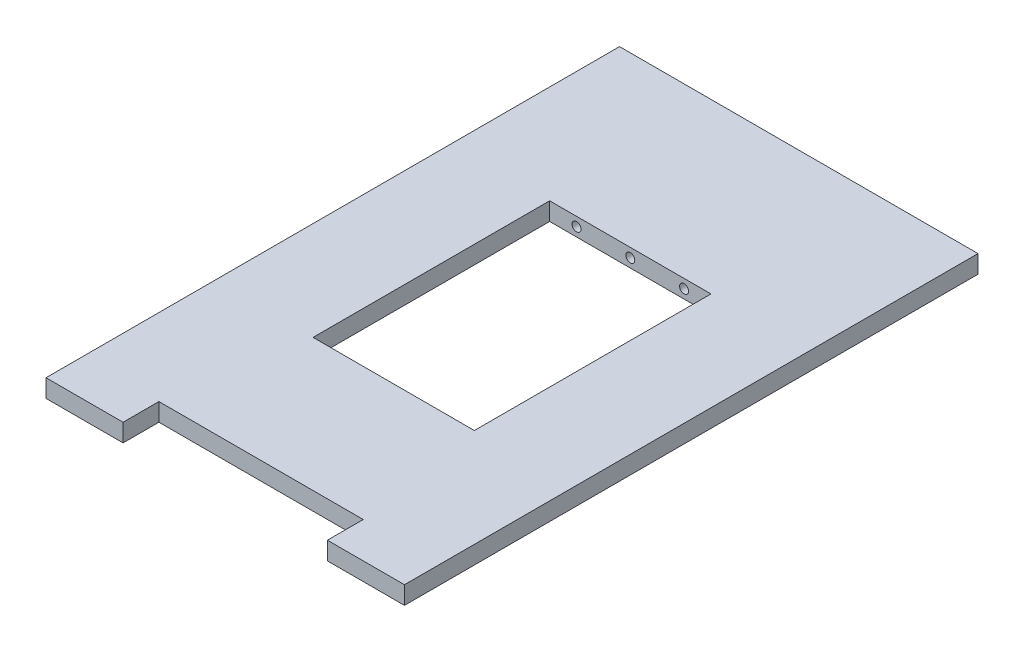
ISO-10303-21;
HEADER;
FILE_DESCRIPTION(('STEP AP214'),'2;1');
FILE_NAME('part.step','',(''),(''),'','','');
FILE_SCHEMA(('AUTOMOTIVE_DESIGN { 1 0 10303 214 1 1 1 1 }'));
ENDSEC;
DATA;
#1=APPLICATION_CONTEXT('core data for automotive mechanical design processes');
#2=APPLICATION_PROTOCOL_DEFINITION('international standard','automotive_design',2000,#1);
#3=PRODUCT_CONTEXT('',#1,'mechanical');
#4=PRODUCT('Part','Part','',(#3));
#5=PRODUCT_RELATED_PRODUCT_CATEGORY('part','',(#4));
#6=PRODUCT_DEFINITION_FORMATION('','',#4);
#7=PRODUCT_DEFINITION_CONTEXT('part definition',#1,'design');
#8=PRODUCT_DEFINITION('design','',#6,#7);
#9=PRODUCT_DEFINITION_SHAPE('','',#8);
#10=(LENGTH_UNIT() NAMED_UNIT(*) SI_UNIT(.MILLI.,.METRE.));
#11=(NAMED_UNIT(*) PLANE_ANGLE_UNIT() SI_UNIT($,.RADIAN.));
#12=(NAMED_UNIT(*) SI_UNIT($,.STERADIAN.) SOLID_ANGLE_UNIT());
#13=UNCERTAINTY_MEASURE_WITH_UNIT(LENGTH_MEASURE(1.E-05),#10,'distance_accuracy_value','');
#14=(GEOMETRIC_REPRESENTATION_CONTEXT(3) GLOBAL_UNCERTAINTY_ASSIGNED_CONTEXT((#13)) GLOBAL_UNIT_ASSIGNED_CONTEXT((#10,
#11,#12)) REPRESENTATION_CONTEXT('',''));
#15=CARTESIAN_POINT('',(0.,0.,0.));
#16=DIRECTION('',(0.,0.,1.));
#17=DIRECTION('',(1.,0.,0.));
#18=AXIS2_PLACEMENT_3D('',#15,#16,#17);
#19=CARTESIAN_POINT('',(-50.,5.,80.));
#20=DIRECTION('',(0.,0.,-1.));
#21=DIRECTION('',(-1.,0.,0.));
#22=AXIS2_PLACEMENT_3D('',#19,#20,#21);
#23=PLANE('',#22);
#24=DIRECTION('',(1.,0.,0.));
#25=VECTOR('',#24,1.);
#26=CARTESIAN_POINT('',(-50.,5.,80.));
#27=LINE('',#26,#25);
#28=CARTESIAN_POINT('',(28.5,5.,80.));
#29=VERTEX_POINT('',#28);
#30=CARTESIAN_POINT('',(50.,5.,80.));
#31=VERTEX_POINT('',#30);
#32=EDGE_CURVE('E199',#29,#31,#27,.T.);
#33=ORIENTED_EDGE('',*,*,#32,.F.);
#34=DIRECTION('',(0.,-1.,0.));
#35=VECTOR('',#34,1.);
#36=CARTESIAN_POINT('',(28.5,5.,80.));
#37=LINE('',#36,#35);
#38=CARTESIAN_POINT('',(28.5,0.,80.));
#39=VERTEX_POINT('',#38);
#40=EDGE_CURVE('E267',#29,#39,#37,.T.);
#41=ORIENTED_EDGE('',*,*,#40,.T.);
#42=DIRECTION('',(1.,0.,0.));
#43=VECTOR('',#42,1.);
#44=CARTESIAN_POINT('',(-50.,0.,80.));
#45=LINE('',#44,#43);
#46=CARTESIAN_POINT('',(50.,0.,80.));
#47=VERTEX_POINT('',#46);
#48=EDGE_CURVE('E160',#39,#47,#45,.T.);
#49=ORIENTED_EDGE('',*,*,#48,.T.);
#50=DIRECTION('',(0.,-1.,0.));
#51=VECTOR('',#50,1.);
#52=CARTESIAN_POINT('',(50.,5.,80.));
#53=LINE('',#52,#51);
#54=EDGE_CURVE('E175',#31,#47,#53,.T.);
#55=ORIENTED_EDGE('',*,*,#54,.F.);
#56=EDGE_LOOP('',(#33,#41,#49,#55));
#57=FACE_BOUND('',#56,.T.);
#58=ADVANCED_FACE('F33',(#57),#23,.F.);
#59=CARTESIAN_POINT('',(50.,5.,80.));
#60=DIRECTION('',(-1.,0.,0.));
#61=DIRECTION('',(0.,0.,1.));
#62=AXIS2_PLACEMENT_3D('',#59,#60,#61);
#63=PLANE('',#62);
#64=DIRECTION('',(0.,0.,-1.));
#65=VECTOR('',#64,1.);
#66=CARTESIAN_POINT('',(50.,0.,80.));
#67=LINE('',#66,#65);
#68=CARTESIAN_POINT('',(50.,0.,-80.));
#69=VERTEX_POINT('',#68);
#70=EDGE_CURVE('E162',#47,#69,#67,.T.);
#71=ORIENTED_EDGE('',*,*,#70,.T.);
#72=DIRECTION('',(0.,-1.,0.));
#73=VECTOR('',#72,1.);
#74=CARTESIAN_POINT('',(50.,5.,-80.));
#75=LINE('',#74,#73);
#76=CARTESIAN_POINT('',(50.,5.,-80.));
#77=VERTEX_POINT('',#76);
#78=EDGE_CURVE('E41',#77,#69,#75,.T.);
#79=ORIENTED_EDGE('',*,*,#78,.F.);
#80=DIRECTION('',(0.,0.,-1.));
#81=VECTOR('',#80,1.);
#82=CARTESIAN_POINT('',(50.,5.,80.));
#83=LINE('',#82,#81);
#84=EDGE_CURVE('E170',#31,#77,#83,.T.);
#85=ORIENTED_EDGE('',*,*,#84,.F.);
#86=ORIENTED_EDGE('',*,*,#54,.T.);
#87=EDGE_LOOP('',(#71,#79,#85,#86));
#88=FACE_BOUND('',#87,.T.);
#89=ADVANCED_FACE('F35',(#88),#63,.F.);
#90=CARTESIAN_POINT('',(-50.,5.,-80.));
#91=DIRECTION('',(0.,0.,1.));
#92=DIRECTION('',(1.,0.,0.));
#93=AXIS2_PLACEMENT_3D('',#90,#91,#92);
#94=PLANE('',#93);
#95=DIRECTION('',(-1.,0.,0.));
#96=VECTOR('',#95,1.);
#97=CARTESIAN_POINT('',(-50.,0.,-80.));
#98=LINE('',#97,#96);
#99=CARTESIAN_POINT('',(-50.,0.,-80.));
#100=VERTEX_POINT('',#99);
#101=EDGE_CURVE('E171',#69,#100,#98,.T.);
#102=ORIENTED_EDGE('',*,*,#101,.T.);
#103=DIRECTION('',(0.,-1.,0.));
#104=VECTOR('',#103,1.);
#105=CARTESIAN_POINT('',(-50.,5.,-80.));
#106=LINE('',#105,#104);
#107=CARTESIAN_POINT('',(-50.,5.,-80.));
#108=VERTEX_POINT('',#107);
#109=EDGE_CURVE('E181',#108,#100,#106,.T.);
#110=ORIENTED_EDGE('',*,*,#109,.F.);
#111=DIRECTION('',(-1.,0.,0.));
#112=VECTOR('',#111,1.);
#113=CARTESIAN_POINT('',(-50.,5.,-80.));
#114=LINE('',#113,#112);
#115=EDGE_CURVE('E188',#77,#108,#114,.T.);
#116=ORIENTED_EDGE('',*,*,#115,.F.);
#117=ORIENTED_EDGE('',*,*,#78,.T.);
#118=EDGE_LOOP('',(#102,#110,#116,#117));
#119=FACE_BOUND('',#118,.T.);
#120=ADVANCED_FACE('F186',(#119),#94,.F.);
#121=CARTESIAN_POINT('',(-50.,5.,80.));
#122=DIRECTION('',(1.,0.,0.));
#123=DIRECTION('',(0.,0.,-1.));
#124=AXIS2_PLACEMENT_3D('',#121,#122,#123);
#125=PLANE('',#124);
#126=DIRECTION('',(0.,0.,1.));
#127=VECTOR('',#126,1.);
#128=CARTESIAN_POINT('',(-50.,0.,80.));
#129=LINE('',#128,#127);
#130=CARTESIAN_POINT('',(-50.,0.,80.));
#131=VERTEX_POINT('',#130);
#132=EDGE_CURVE('E167',#100,#131,#129,.T.);
#133=ORIENTED_EDGE('',*,*,#132,.T.);
#134=DIRECTION('',(0.,-1.,0.));
#135=VECTOR('',#134,1.);
#136=CARTESIAN_POINT('',(-50.,5.,80.));
#137=LINE('',#136,#135);
#138=CARTESIAN_POINT('',(-50.,5.,80.));
#139=VERTEX_POINT('',#138);
#140=EDGE_CURVE('E177',#139,#131,#137,.T.);
#141=ORIENTED_EDGE('',*,*,#140,.F.);
#142=DIRECTION('',(0.,0.,1.));
#143=VECTOR('',#142,1.);
#144=CARTESIAN_POINT('',(-50.,5.,80.));
#145=LINE('',#144,#143);
#146=EDGE_CURVE('E200',#108,#139,#145,.T.);
#147=ORIENTED_EDGE('',*,*,#146,.F.);
#148=ORIENTED_EDGE('',*,*,#109,.T.);
#149=EDGE_LOOP('',(#133,#141,#147,#148));
#150=FACE_BOUND('',#149,.T.);
#151=ADVANCED_FACE('F285',(#150),#125,.F.);
#152=CARTESIAN_POINT('',(-28.5,0.,80.));
#153=VERTEX_POINT('',#152);
#154=EDGE_CURVE('E166',#131,#153,#45,.T.);
#155=ORIENTED_EDGE('',*,*,#154,.T.);
#156=DIRECTION('',(0.,1.,0.));
#157=VECTOR('',#156,1.);
#158=CARTESIAN_POINT('',(-28.5,5.,80.));
#159=LINE('',#158,#157);
#160=CARTESIAN_POINT('',(-28.5,5.,80.));
#161=VERTEX_POINT('',#160);
#162=EDGE_CURVE('E269',#153,#161,#159,.T.);
#163=ORIENTED_EDGE('',*,*,#162,.T.);
#164=EDGE_CURVE('E178',#139,#161,#27,.T.);
#165=ORIENTED_EDGE('',*,*,#164,.F.);
#166=ORIENTED_EDGE('',*,*,#140,.T.);
#167=EDGE_LOOP('',(#155,#163,#165,#166));
#168=FACE_BOUND('',#167,.T.);
#169=ADVANCED_FACE('F280',(#168),#23,.F.);
#170=CARTESIAN_POINT('',(0.,5.,0.));
#171=DIRECTION('',(0.,-1.,0.));
#172=DIRECTION('',(0.,0.,-1.));
#173=AXIS2_PLACEMENT_3D('',#170,#171,#172);
#174=PLANE('',#173);
#175=DIRECTION('',(-1.,0.,0.));
#176=VECTOR('',#175,1.);
#177=CARTESIAN_POINT('',(-22.5,5.,-33.));
#178=LINE('',#177,#176);
#179=CARTESIAN_POINT('',(22.5,5.,-33.));
#180=VERTEX_POINT('',#179);
#181=CARTESIAN_POINT('',(-22.5,5.,-33.));
#182=VERTEX_POINT('',#181);
#183=EDGE_CURVE('E217',#180,#182,#178,.T.);
#184=ORIENTED_EDGE('',*,*,#183,.F.);
#185=DIRECTION('',(0.,0.,-1.));
#186=VECTOR('',#185,1.);
#187=CARTESIAN_POINT('',(22.5,5.,33.));
#188=LINE('',#187,#186);
#189=CARTESIAN_POINT('',(22.5,5.,33.));
#190=VERTEX_POINT('',#189);
#191=EDGE_CURVE('E56',#190,#180,#188,.T.);
#192=ORIENTED_EDGE('',*,*,#191,.F.);
#193=DIRECTION('',(1.,0.,0.));
#194=VECTOR('',#193,1.);
#195=CARTESIAN_POINT('',(-22.5,5.,33.));
#196=LINE('',#195,#194);
#197=CARTESIAN_POINT('',(-22.5,5.,33.));
#198=VERTEX_POINT('',#197);
#199=EDGE_CURVE('E210',#198,#190,#196,.T.);
#200=ORIENTED_EDGE('',*,*,#199,.F.);
#201=DIRECTION('',(0.,0.,1.));
#202=VECTOR('',#201,1.);
#203=CARTESIAN_POINT('',(-22.5,5.,33.));
#204=LINE('',#203,#202);
#205=EDGE_CURVE('E214',#182,#198,#204,.T.);
#206=ORIENTED_EDGE('',*,*,#205,.F.);
#207=EDGE_LOOP('',(#184,#192,#200,#206));
#208=FACE_BOUND('',#207,.T.);
#209=DIRECTION('',(-1.,0.,0.));
#210=VECTOR('',#209,1.);
#211=CARTESIAN_POINT('',(-28.5,5.,70.0000000000001));
#212=LINE('',#211,#210);
#213=CARTESIAN_POINT('',(28.5,5.,70.0000000000001));
#214=VERTEX_POINT('',#213);
#215=CARTESIAN_POINT('',(-28.5,5.,70.0000000000001));
#216=VERTEX_POINT('',#215);
#217=EDGE_CURVE('E274',#214,#216,#212,.T.);
#218=ORIENTED_EDGE('',*,*,#217,.F.);
#219=DIRECTION('',(0.,0.,-1.));
#220=VECTOR('',#219,1.);
#221=CARTESIAN_POINT('',(28.5,5.,90.0000000000001));
#222=LINE('',#221,#220);
#223=EDGE_CURVE('E144',#29,#214,#222,.T.);
#224=ORIENTED_EDGE('',*,*,#223,.F.);
#225=ORIENTED_EDGE('',*,*,#32,.T.);
#226=ORIENTED_EDGE('',*,*,#84,.T.);
#227=ORIENTED_EDGE('',*,*,#115,.T.);
#228=ORIENTED_EDGE('',*,*,#146,.T.);
#229=ORIENTED_EDGE('',*,*,#164,.T.);
#230=DIRECTION('',(0.,0.,1.));
#231=VECTOR('',#230,1.);
#232=CARTESIAN_POINT('',(-28.5,5.,90.0000000000001));
#233=LINE('',#232,#231);
#234=EDGE_CURVE('E154',#216,#161,#233,.T.);
#235=ORIENTED_EDGE('',*,*,#234,.F.);
#236=EDGE_LOOP('',(#218,#224,#225,#226,#227,#228,#229,#235));
#237=FACE_BOUND('',#236,.T.);
#238=ADVANCED_FACE('F287',(#208,#237),#174,.F.);
#239=CARTESIAN_POINT('',(0.,0.,0.));
#240=DIRECTION('',(0.,-1.,0.));
#241=DIRECTION('',(0.,0.,-1.));
#242=AXIS2_PLACEMENT_3D('',#239,#240,#241);
#243=PLANE('',#242);
#244=DIRECTION('',(0.,0.,1.));
#245=VECTOR('',#244,1.);
#246=CARTESIAN_POINT('',(28.5,0.,0.));
#247=LINE('',#246,#245);
#248=CARTESIAN_POINT('',(28.5,0.,70.0000000000001));
#249=VERTEX_POINT('',#248);
#250=EDGE_CURVE('E11',#249,#39,#247,.T.);
#251=ORIENTED_EDGE('',*,*,#250,.F.);
#252=DIRECTION('',(-1.,0.,0.));
#253=VECTOR('',#252,1.);
#254=CARTESIAN_POINT('',(-28.5,0.,70.0000000000001));
#255=LINE('',#254,#253);
#256=CARTESIAN_POINT('',(-28.5,0.,70.0000000000001));
#257=VERTEX_POINT('',#256);
#258=EDGE_CURVE('E151',#249,#257,#255,.T.);
#259=ORIENTED_EDGE('',*,*,#258,.T.);
#260=DIRECTION('',(0.,0.,1.));
#261=VECTOR('',#260,1.);
#262=CARTESIAN_POINT('',(-28.5,0.,90.0000000000001));
#263=LINE('',#262,#261);
#264=EDGE_CURVE('E48',#257,#153,#263,.T.);
#265=ORIENTED_EDGE('',*,*,#264,.T.);
#266=ORIENTED_EDGE('',*,*,#154,.F.);
#267=ORIENTED_EDGE('',*,*,#132,.F.);
#268=ORIENTED_EDGE('',*,*,#101,.F.);
#269=ORIENTED_EDGE('',*,*,#70,.F.);
#270=ORIENTED_EDGE('',*,*,#48,.F.);
#271=EDGE_LOOP('',(#251,#259,#265,#266,#267,#268,#269,#270));
#272=FACE_BOUND('',#271,.T.);
#273=DIRECTION('',(0.,0.,-1.));
#274=VECTOR('',#273,1.);
#275=CARTESIAN_POINT('',(22.5,0.,33.));
#276=LINE('',#275,#274);
#277=CARTESIAN_POINT('',(22.5,0.,33.));
#278=VERTEX_POINT('',#277);
#279=CARTESIAN_POINT('',(22.5,0.,-33.));
#280=VERTEX_POINT('',#279);
#281=EDGE_CURVE('E213',#278,#280,#276,.T.);
#282=ORIENTED_EDGE('',*,*,#281,.T.);
#283=DIRECTION('',(-1.,0.,0.));
#284=VECTOR('',#283,1.);
#285=CARTESIAN_POINT('',(-22.5,0.,-33.));
#286=LINE('',#285,#284);
#287=CARTESIAN_POINT('',(-22.5,0.,-33.));
#288=VERTEX_POINT('',#287);
#289=EDGE_CURVE('E227',#280,#288,#286,.T.);
#290=ORIENTED_EDGE('',*,*,#289,.T.);
#291=DIRECTION('',(0.,0.,1.));
#292=VECTOR('',#291,1.);
#293=CARTESIAN_POINT('',(-22.5,0.,33.));
#294=LINE('',#293,#292);
#295=CARTESIAN_POINT('',(-22.5,0.,33.));
#296=VERTEX_POINT('',#295);
#297=EDGE_CURVE('E224',#288,#296,#294,.T.);
#298=ORIENTED_EDGE('',*,*,#297,.T.);
#299=DIRECTION('',(1.,0.,0.));
#300=VECTOR('',#299,1.);
#301=CARTESIAN_POINT('',(-22.5,0.,33.));
#302=LINE('',#301,#300);
#303=EDGE_CURVE('E207',#296,#278,#302,.T.);
#304=ORIENTED_EDGE('',*,*,#303,.T.);
#305=EDGE_LOOP('',(#282,#290,#298,#304));
#306=FACE_BOUND('',#305,.T.);
#307=ADVANCED_FACE('F157',(#272,#306),#243,.T.);
#308=CARTESIAN_POINT('',(22.5,0.,33.));
#309=DIRECTION('',(1.,0.,0.));
#310=DIRECTION('',(0.,0.,-1.));
#311=AXIS2_PLACEMENT_3D('',#308,#309,#310);
#312=PLANE('',#311);
#313=ORIENTED_EDGE('',*,*,#191,.T.);
#314=DIRECTION('',(0.,1.,0.));
#315=VECTOR('',#314,1.);
#316=CARTESIAN_POINT('',(22.5,0.,-33.));
#317=LINE('',#316,#315);
#318=EDGE_CURVE('E204',#280,#180,#317,.T.);
#319=ORIENTED_EDGE('',*,*,#318,.F.);
#320=ORIENTED_EDGE('',*,*,#281,.F.);
#321=DIRECTION('',(0.,1.,0.));
#322=VECTOR('',#321,1.);
#323=CARTESIAN_POINT('',(22.5,0.,33.));
#324=LINE('',#323,#322);
#325=EDGE_CURVE('E192',#278,#190,#324,.T.);
#326=ORIENTED_EDGE('',*,*,#325,.T.);
#327=EDGE_LOOP('',(#313,#319,#320,#326));
#328=FACE_BOUND('',#327,.T.);
#329=ADVANCED_FACE('F339',(#328),#312,.F.);
#330=CARTESIAN_POINT('',(-22.5,0.,33.));
#331=DIRECTION('',(0.,0.,1.));
#332=DIRECTION('',(1.,0.,0.));
#333=AXIS2_PLACEMENT_3D('',#330,#331,#332);
#334=PLANE('',#333);
#335=CARTESIAN_POINT('',(0.,2.5,33.));
#336=DIRECTION('',(0.,0.,-1.));
#337=DIRECTION('',(-1.,0.,0.));
#338=AXIS2_PLACEMENT_3D('',#335,#336,#337);
#339=CIRCLE('',#338,1.24999999999999);
#340=CARTESIAN_POINT('',(-1.24999999999999,2.5,33.));
#341=VERTEX_POINT('',#340);
#342=EDGE_CURVE('E264',#341,#341,#339,.T.);
#343=ORIENTED_EDGE('',*,*,#342,.F.);
#344=EDGE_LOOP('',(#343));
#345=FACE_BOUND('',#344,.T.);
#346=CARTESIAN_POINT('',(-15.,2.5,33.));
#347=DIRECTION('',(0.,0.,-1.));
#348=DIRECTION('',(-1.,0.,0.));
#349=AXIS2_PLACEMENT_3D('',#346,#347,#348);
#350=CIRCLE('',#349,1.24999999999999);
#351=CARTESIAN_POINT('',(-16.25,2.5,33.));
#352=VERTEX_POINT('',#351);
#353=EDGE_CURVE('E258',#352,#352,#350,.T.);
#354=ORIENTED_EDGE('',*,*,#353,.F.);
#355=EDGE_LOOP('',(#354));
#356=FACE_BOUND('',#355,.T.);
#357=CARTESIAN_POINT('',(15.,2.5,33.));
#358=DIRECTION('',(0.,0.,-1.));
#359=DIRECTION('',(-1.,0.,0.));
#360=AXIS2_PLACEMENT_3D('',#357,#358,#359);
#361=CIRCLE('',#360,1.24999999999999);
#362=CARTESIAN_POINT('',(13.75,2.5,33.));
#363=VERTEX_POINT('',#362);
#364=EDGE_CURVE('E252',#363,#363,#361,.T.);
#365=ORIENTED_EDGE('',*,*,#364,.F.);
#366=EDGE_LOOP('',(#365));
#367=FACE_BOUND('',#366,.T.);
#368=ORIENTED_EDGE('',*,*,#199,.T.);
#369=ORIENTED_EDGE('',*,*,#325,.F.);
#370=ORIENTED_EDGE('',*,*,#303,.F.);
#371=DIRECTION('',(0.,1.,0.));
#372=VECTOR('',#371,1.);
#373=CARTESIAN_POINT('',(-22.5,0.,33.));
#374=LINE('',#373,#372);
#375=EDGE_CURVE('E194',#296,#198,#374,.T.);
#376=ORIENTED_EDGE('',*,*,#375,.T.);
#377=EDGE_LOOP('',(#368,#369,#370,#376));
#378=FACE_BOUND('',#377,.T.);
#379=ADVANCED_FACE('F346',(#345,#356,#367,#378),#334,.F.);
#380=CARTESIAN_POINT('',(-22.5,0.,33.));
#381=DIRECTION('',(-1.,0.,0.));
#382=DIRECTION('',(0.,0.,1.));
#383=AXIS2_PLACEMENT_3D('',#380,#381,#382);
#384=PLANE('',#383);
#385=ORIENTED_EDGE('',*,*,#205,.T.);
#386=ORIENTED_EDGE('',*,*,#375,.F.);
#387=ORIENTED_EDGE('',*,*,#297,.F.);
#388=DIRECTION('',(0.,1.,0.));
#389=VECTOR('',#388,1.);
#390=CARTESIAN_POINT('',(-22.5,0.,-33.));
#391=LINE('',#390,#389);
#392=EDGE_CURVE('E206',#288,#182,#391,.T.);
#393=ORIENTED_EDGE('',*,*,#392,.T.);
#394=EDGE_LOOP('',(#385,#386,#387,#393));
#395=FACE_BOUND('',#394,.T.);
#396=ADVANCED_FACE('F355',(#395),#384,.F.);
#397=CARTESIAN_POINT('',(-22.5,0.,-33.));
#398=DIRECTION('',(0.,0.,-1.));
#399=DIRECTION('',(-1.,0.,0.));
#400=AXIS2_PLACEMENT_3D('',#397,#398,#399);
#401=PLANE('',#400);
#402=CARTESIAN_POINT('',(0.,2.5,-33.));
#403=DIRECTION('',(0.,0.,1.));
#404=DIRECTION('',(1.,0.,0.));
#405=AXIS2_PLACEMENT_3D('',#402,#403,#404);
#406=CIRCLE('',#405,1.24999999999999);
#407=CARTESIAN_POINT('',(1.24999999999999,2.5,-33.));
#408=VERTEX_POINT('',#407);
#409=EDGE_CURVE('E246',#408,#408,#406,.T.);
#410=ORIENTED_EDGE('',*,*,#409,.F.);
#411=EDGE_LOOP('',(#410));
#412=FACE_BOUND('',#411,.T.);
#413=CARTESIAN_POINT('',(15.,2.5,-33.));
#414=DIRECTION('',(0.,0.,1.));
#415=DIRECTION('',(1.,0.,0.));
#416=AXIS2_PLACEMENT_3D('',#413,#414,#415);
#417=CIRCLE('',#416,1.24999999999999);
#418=CARTESIAN_POINT('',(16.25,2.5,-33.));
#419=VERTEX_POINT('',#418);
#420=EDGE_CURVE('E240',#419,#419,#417,.T.);
#421=ORIENTED_EDGE('',*,*,#420,.F.);
#422=EDGE_LOOP('',(#421));
#423=FACE_BOUND('',#422,.T.);
#424=CARTESIAN_POINT('',(-15.,2.49999999999999,-33.));
#425=DIRECTION('',(0.,0.,1.));
#426=DIRECTION('',(1.,0.,0.));
#427=AXIS2_PLACEMENT_3D('',#424,#425,#426);
#428=CIRCLE('',#427,1.24999999999999);
#429=CARTESIAN_POINT('',(-13.75,2.49999999999999,-33.));
#430=VERTEX_POINT('',#429);
#431=EDGE_CURVE('E234',#430,#430,#428,.T.);
#432=ORIENTED_EDGE('',*,*,#431,.F.);
#433=EDGE_LOOP('',(#432));
#434=FACE_BOUND('',#433,.T.);
#435=ORIENTED_EDGE('',*,*,#183,.T.);
#436=ORIENTED_EDGE('',*,*,#392,.F.);
#437=ORIENTED_EDGE('',*,*,#289,.F.);
#438=ORIENTED_EDGE('',*,*,#318,.T.);
#439=EDGE_LOOP('',(#435,#436,#437,#438));
#440=FACE_BOUND('',#439,.T.);
#441=ADVANCED_FACE('F365',(#412,#423,#434,#440),#401,.F.);
#442=CARTESIAN_POINT('',(-15.,2.49999999999999,-43.));
#443=DIRECTION('',(0.,0.,1.));
#444=DIRECTION('',(1.,0.,0.));
#445=AXIS2_PLACEMENT_3D('',#442,#443,#444);
#446=CONICAL_SURFACE('',#445,1.25,1.02974425867665);
#447=CARTESIAN_POINT('',(-15.,2.49999999999999,-43.7510757737845));
#448=VERTEX_POINT('',#447);
#449=VERTEX_LOOP('',#448);
#450=FACE_BOUND('',#449,.T.);
#451=CARTESIAN_POINT('',(-15.,2.49999999999999,-43.));
#452=DIRECTION('',(0.,0.,1.));
#453=DIRECTION('',(1.,0.,0.));
#454=AXIS2_PLACEMENT_3D('',#451,#452,#453);
#455=CIRCLE('',#454,1.25);
#456=CARTESIAN_POINT('',(-13.75,2.49999999999999,-43.));
#457=VERTEX_POINT('',#456);
#458=EDGE_CURVE('E221',#457,#457,#455,.T.);
#459=ORIENTED_EDGE('',*,*,#458,.T.);
#460=EDGE_LOOP('',(#459));
#461=FACE_BOUND('',#460,.T.);
#462=ADVANCED_FACE('F374',(#450,#461),#446,.F.);
#463=CARTESIAN_POINT('',(-15.,2.49999999999999,-33.));
#464=DIRECTION('',(0.,0.,1.));
#465=DIRECTION('',(1.,0.,0.));
#466=AXIS2_PLACEMENT_3D('',#463,#464,#465);
#467=CYLINDRICAL_SURFACE('',#466,1.24999999999999);
#468=ORIENTED_EDGE('',*,*,#458,.F.);
#469=EDGE_LOOP('',(#468));
#470=FACE_BOUND('',#469,.T.);
#471=ORIENTED_EDGE('',*,*,#431,.T.);
#472=EDGE_LOOP('',(#471));
#473=FACE_BOUND('',#472,.T.);
#474=ADVANCED_FACE('F383',(#470,#473),#467,.F.);
#475=CARTESIAN_POINT('',(15.,2.5,-43.));
#476=DIRECTION('',(0.,0.,1.));
#477=DIRECTION('',(1.,0.,0.));
#478=AXIS2_PLACEMENT_3D('',#475,#476,#477);
#479=CONICAL_SURFACE('',#478,1.25,1.02974425867665);
#480=CARTESIAN_POINT('',(15.,2.5,-43.7510757737845));
#481=VERTEX_POINT('',#480);
#482=VERTEX_LOOP('',#481);
#483=FACE_BOUND('',#482,.T.);
#484=CARTESIAN_POINT('',(15.,2.5,-43.));
#485=DIRECTION('',(0.,0.,1.));
#486=DIRECTION('',(1.,0.,0.));
#487=AXIS2_PLACEMENT_3D('',#484,#485,#486);
#488=CIRCLE('',#487,1.25);
#489=CARTESIAN_POINT('',(16.25,2.5,-43.));
#490=VERTEX_POINT('',#489);
#491=EDGE_CURVE('E237',#490,#490,#488,.T.);
#492=ORIENTED_EDGE('',*,*,#491,.T.);
#493=EDGE_LOOP('',(#492));
#494=FACE_BOUND('',#493,.T.);
#495=ADVANCED_FACE('F392',(#483,#494),#479,.F.);
#496=CARTESIAN_POINT('',(15.,2.5,-33.));
#497=DIRECTION('',(0.,0.,1.));
#498=DIRECTION('',(1.,0.,0.));
#499=AXIS2_PLACEMENT_3D('',#496,#497,#498);
#500=CYLINDRICAL_SURFACE('',#499,1.24999999999999);
#501=ORIENTED_EDGE('',*,*,#491,.F.);
#502=EDGE_LOOP('',(#501));
#503=FACE_BOUND('',#502,.T.);
#504=ORIENTED_EDGE('',*,*,#420,.T.);
#505=EDGE_LOOP('',(#504));
#506=FACE_BOUND('',#505,.T.);
#507=ADVANCED_FACE('F401',(#503,#506),#500,.F.);
#508=CARTESIAN_POINT('',(0.,2.5,-43.));
#509=DIRECTION('',(0.,0.,1.));
#510=DIRECTION('',(1.,0.,0.));
#511=AXIS2_PLACEMENT_3D('',#508,#509,#510);
#512=CONICAL_SURFACE('',#511,1.25,1.02974425867665);
#513=CARTESIAN_POINT('',(0.,2.5,-43.7510757737845));
#514=VERTEX_POINT('',#513);
#515=VERTEX_LOOP('',#514);
#516=FACE_BOUND('',#515,.T.);
#517=CARTESIAN_POINT('',(0.,2.5,-43.));
#518=DIRECTION('',(0.,0.,1.));
#519=DIRECTION('',(1.,0.,0.));
#520=AXIS2_PLACEMENT_3D('',#517,#518,#519);
#521=CIRCLE('',#520,1.25);
#522=CARTESIAN_POINT('',(1.25,2.5,-43.));
#523=VERTEX_POINT('',#522);
#524=EDGE_CURVE('E243',#523,#523,#521,.T.);
#525=ORIENTED_EDGE('',*,*,#524,.T.);
#526=EDGE_LOOP('',(#525));
#527=FACE_BOUND('',#526,.T.);
#528=ADVANCED_FACE('F410',(#516,#527),#512,.F.);
#529=CARTESIAN_POINT('',(0.,2.5,-33.));
#530=DIRECTION('',(0.,0.,1.));
#531=DIRECTION('',(1.,0.,0.));
#532=AXIS2_PLACEMENT_3D('',#529,#530,#531);
#533=CYLINDRICAL_SURFACE('',#532,1.24999999999999);
#534=ORIENTED_EDGE('',*,*,#524,.F.);
#535=EDGE_LOOP('',(#534));
#536=FACE_BOUND('',#535,.T.);
#537=ORIENTED_EDGE('',*,*,#409,.T.);
#538=EDGE_LOOP('',(#537));
#539=FACE_BOUND('',#538,.T.);
#540=ADVANCED_FACE('F419',(#536,#539),#533,.F.);
#541=CARTESIAN_POINT('',(15.,2.5,43.));
#542=DIRECTION('',(0.,0.,-1.));
#543=DIRECTION('',(-1.,0.,0.));
#544=AXIS2_PLACEMENT_3D('',#541,#542,#543);
#545=CONICAL_SURFACE('',#544,1.24999999999999,1.02974425867664);
#546=CARTESIAN_POINT('',(15.,2.5,43.7510757737845));
#547=VERTEX_POINT('',#546);
#548=VERTEX_LOOP('',#547);
#549=FACE_BOUND('',#548,.T.);
#550=CARTESIAN_POINT('',(15.,2.5,43.));
#551=DIRECTION('',(0.,0.,-1.));
#552=DIRECTION('',(-1.,0.,0.));
#553=AXIS2_PLACEMENT_3D('',#550,#551,#552);
#554=CIRCLE('',#553,1.24999999999999);
#555=CARTESIAN_POINT('',(13.75,2.5,43.));
#556=VERTEX_POINT('',#555);
#557=EDGE_CURVE('E249',#556,#556,#554,.T.);
#558=ORIENTED_EDGE('',*,*,#557,.T.);
#559=EDGE_LOOP('',(#558));
#560=FACE_BOUND('',#559,.T.);
#561=ADVANCED_FACE('F427',(#549,#560),#545,.F.);
#562=CARTESIAN_POINT('',(15.,2.5,33.));
#563=DIRECTION('',(0.,0.,-1.));
#564=DIRECTION('',(-1.,0.,0.));
#565=AXIS2_PLACEMENT_3D('',#562,#563,#564);
#566=CYLINDRICAL_SURFACE('',#565,1.24999999999999);
#567=ORIENTED_EDGE('',*,*,#557,.F.);
#568=EDGE_LOOP('',(#567));
#569=FACE_BOUND('',#568,.T.);
#570=ORIENTED_EDGE('',*,*,#364,.T.);
#571=EDGE_LOOP('',(#570));
#572=FACE_BOUND('',#571,.T.);
#573=ADVANCED_FACE('F435',(#569,#572),#566,.F.);
#574=CARTESIAN_POINT('',(-15.,2.5,43.));
#575=DIRECTION('',(0.,0.,-1.));
#576=DIRECTION('',(-1.,0.,0.));
#577=AXIS2_PLACEMENT_3D('',#574,#575,#576);
#578=CONICAL_SURFACE('',#577,1.24999999999999,1.02974425867664);
#579=CARTESIAN_POINT('',(-15.,2.5,43.7510757737845));
#580=VERTEX_POINT('',#579);
#581=VERTEX_LOOP('',#580);
#582=FACE_BOUND('',#581,.T.);
#583=CARTESIAN_POINT('',(-15.,2.5,43.));
#584=DIRECTION('',(0.,0.,-1.));
#585=DIRECTION('',(-1.,0.,0.));
#586=AXIS2_PLACEMENT_3D('',#583,#584,#585);
#587=CIRCLE('',#586,1.24999999999999);
#588=CARTESIAN_POINT('',(-16.25,2.5,43.));
#589=VERTEX_POINT('',#588);
#590=EDGE_CURVE('E255',#589,#589,#587,.T.);
#591=ORIENTED_EDGE('',*,*,#590,.T.);
#592=EDGE_LOOP('',(#591));
#593=FACE_BOUND('',#592,.T.);
#594=ADVANCED_FACE('F444',(#582,#593),#578,.F.);
#595=CARTESIAN_POINT('',(-15.,2.5,33.));
#596=DIRECTION('',(0.,0.,-1.));
#597=DIRECTION('',(-1.,0.,0.));
#598=AXIS2_PLACEMENT_3D('',#595,#596,#597);
#599=CYLINDRICAL_SURFACE('',#598,1.24999999999999);
#600=ORIENTED_EDGE('',*,*,#590,.F.);
#601=EDGE_LOOP('',(#600));
#602=FACE_BOUND('',#601,.T.);
#603=ORIENTED_EDGE('',*,*,#353,.T.);
#604=EDGE_LOOP('',(#603));
#605=FACE_BOUND('',#604,.T.);
#606=ADVANCED_FACE('F453',(#602,#605),#599,.F.);
#607=CARTESIAN_POINT('',(0.,2.5,43.));
#608=DIRECTION('',(0.,0.,-1.));
#609=DIRECTION('',(-1.,0.,0.));
#610=AXIS2_PLACEMENT_3D('',#607,#608,#609);
#611=CONICAL_SURFACE('',#610,1.24999999999999,1.02974425867665);
#612=CARTESIAN_POINT('',(0.,2.5,43.7510757737845));
#613=VERTEX_POINT('',#612);
#614=VERTEX_LOOP('',#613);
#615=FACE_BOUND('',#614,.T.);
#616=CARTESIAN_POINT('',(0.,2.5,43.));
#617=DIRECTION('',(0.,0.,-1.));
#618=DIRECTION('',(-1.,0.,0.));
#619=AXIS2_PLACEMENT_3D('',#616,#617,#618);
#620=CIRCLE('',#619,1.24999999999999);
#621=CARTESIAN_POINT('',(-1.24999999999999,2.5,43.));
#622=VERTEX_POINT('',#621);
#623=EDGE_CURVE('E261',#622,#622,#620,.T.);
#624=ORIENTED_EDGE('',*,*,#623,.T.);
#625=EDGE_LOOP('',(#624));
#626=FACE_BOUND('',#625,.T.);
#627=ADVANCED_FACE('F462',(#615,#626),#611,.F.);
#628=CARTESIAN_POINT('',(0.,2.5,33.));
#629=DIRECTION('',(0.,0.,-1.));
#630=DIRECTION('',(-1.,0.,0.));
#631=AXIS2_PLACEMENT_3D('',#628,#629,#630);
#632=CYLINDRICAL_SURFACE('',#631,1.24999999999999);
#633=ORIENTED_EDGE('',*,*,#623,.F.);
#634=EDGE_LOOP('',(#633));
#635=FACE_BOUND('',#634,.T.);
#636=ORIENTED_EDGE('',*,*,#342,.T.);
#637=EDGE_LOOP('',(#636));
#638=FACE_BOUND('',#637,.T.);
#639=ADVANCED_FACE('F471',(#635,#638),#632,.F.);
#640=CARTESIAN_POINT('',(28.5,0.,90.0000000000001));
#641=DIRECTION('',(1.,0.,0.));
#642=DIRECTION('',(0.,0.,-1.));
#643=AXIS2_PLACEMENT_3D('',#640,#641,#642);
#644=PLANE('',#643);
#645=ORIENTED_EDGE('',*,*,#223,.T.);
#646=DIRECTION('',(0.,1.,0.));
#647=VECTOR('',#646,1.);
#648=CARTESIAN_POINT('',(28.5,0.,70.0000000000001));
#649=LINE('',#648,#647);
#650=EDGE_CURVE('E138',#249,#214,#649,.T.);
#651=ORIENTED_EDGE('',*,*,#650,.F.);
#652=ORIENTED_EDGE('',*,*,#250,.T.);
#653=ORIENTED_EDGE('',*,*,#40,.F.);
#654=EDGE_LOOP('',(#645,#651,#652,#653));
#655=FACE_BOUND('',#654,.T.);
#656=ADVANCED_FACE('F140',(#655),#644,.F.);
#657=CARTESIAN_POINT('',(-28.5,0.,90.0000000000001));
#658=DIRECTION('',(-1.,0.,0.));
#659=DIRECTION('',(0.,0.,1.));
#660=AXIS2_PLACEMENT_3D('',#657,#658,#659);
#661=PLANE('',#660);
#662=ORIENTED_EDGE('',*,*,#264,.F.);
#663=DIRECTION('',(0.,1.,0.));
#664=VECTOR('',#663,1.);
#665=CARTESIAN_POINT('',(-28.5,0.,70.0000000000001));
#666=LINE('',#665,#664);
#667=EDGE_CURVE('E148',#257,#216,#666,.T.);
#668=ORIENTED_EDGE('',*,*,#667,.T.);
#669=ORIENTED_EDGE('',*,*,#234,.T.);
#670=ORIENTED_EDGE('',*,*,#162,.F.);
#671=EDGE_LOOP('',(#662,#668,#669,#670));
#672=FACE_BOUND('',#671,.T.);
#673=ADVANCED_FACE('F491',(#672),#661,.F.);
#674=CARTESIAN_POINT('',(-28.5,0.,70.0000000000001));
#675=DIRECTION('',(0.,0.,-1.));
#676=DIRECTION('',(-1.,0.,0.));
#677=AXIS2_PLACEMENT_3D('',#674,#675,#676);
#678=PLANE('',#677);
#679=ORIENTED_EDGE('',*,*,#217,.T.);
#680=ORIENTED_EDGE('',*,*,#667,.F.);
#681=ORIENTED_EDGE('',*,*,#258,.F.);
#682=ORIENTED_EDGE('',*,*,#650,.T.);
#683=EDGE_LOOP('',(#679,#680,#681,#682));
#684=FACE_BOUND('',#683,.T.);
#685=ADVANCED_FACE('F152',(#684),#678,.F.);
#686=CLOSED_SHELL('',(#58,#89,#120,#151,#169,#238,#307,#329,#379,#396,#441,#462,#474,#495,#507,
#528,#540,#561,#573,#594,#606,#627,#639,#656,#673,#685));
#687=MANIFOLD_SOLID_BREP('B2',#686);
#688=ADVANCED_BREP_SHAPE_REPRESENTATION('',(#18,#687),#14);
#689=SHAPE_DEFINITION_REPRESENTATION(#9,#688);
ENDSEC;
END-ISO-10303-21;
